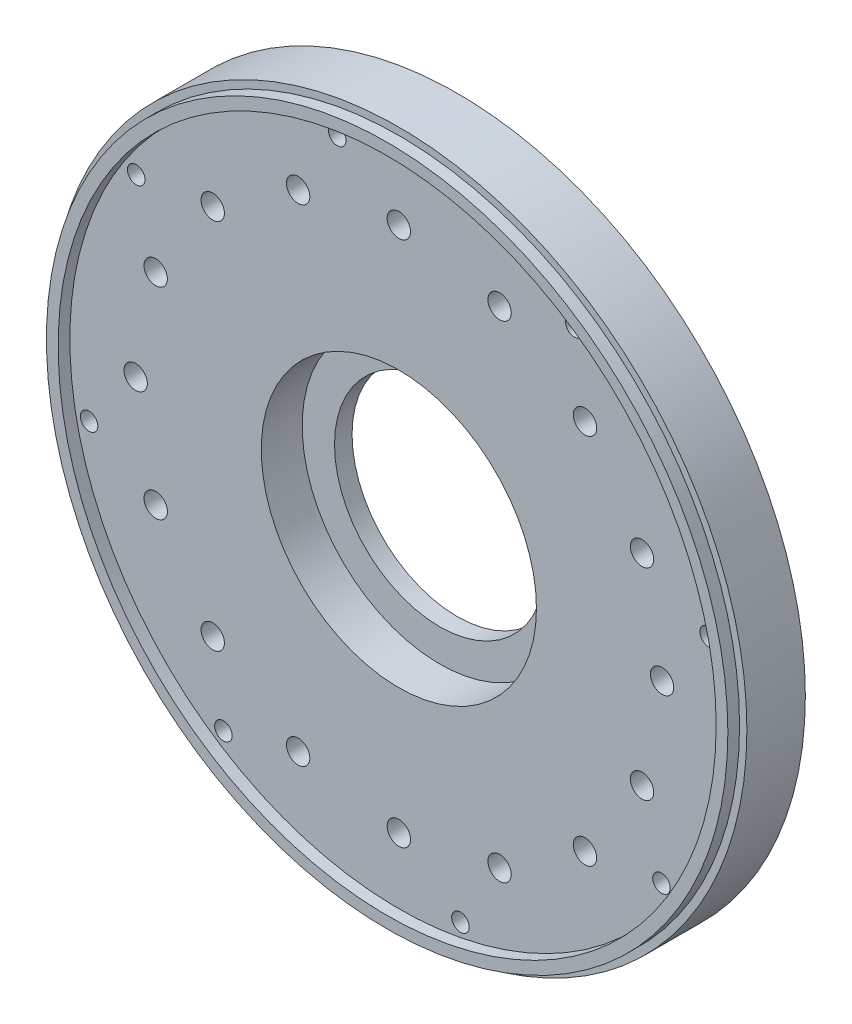
ISO-10303-21;
HEADER;
FILE_DESCRIPTION(('STEP AP214'),'2;1');
FILE_NAME('part.step','',(''),(''),'','','');
FILE_SCHEMA(('AUTOMOTIVE_DESIGN { 1 0 10303 214 1 1 1 1 }'));
ENDSEC;
DATA;
#1=APPLICATION_CONTEXT('core data for automotive mechanical design processes');
#2=APPLICATION_PROTOCOL_DEFINITION('international standard','automotive_design',2000,#1);
#3=PRODUCT_CONTEXT('',#1,'mechanical');
#4=PRODUCT('Part','Part','',(#3));
#5=PRODUCT_RELATED_PRODUCT_CATEGORY('part','',(#4));
#6=PRODUCT_DEFINITION_FORMATION('','',#4);
#7=PRODUCT_DEFINITION_CONTEXT('part definition',#1,'design');
#8=PRODUCT_DEFINITION('design','',#6,#7);
#9=PRODUCT_DEFINITION_SHAPE('','',#8);
#10=(LENGTH_UNIT() NAMED_UNIT(*) SI_UNIT(.MILLI.,.METRE.));
#11=(NAMED_UNIT(*) PLANE_ANGLE_UNIT() SI_UNIT($,.RADIAN.));
#12=(NAMED_UNIT(*) SI_UNIT($,.STERADIAN.) SOLID_ANGLE_UNIT());
#13=UNCERTAINTY_MEASURE_WITH_UNIT(LENGTH_MEASURE(1.E-05),#10,'distance_accuracy_value','');
#14=(GEOMETRIC_REPRESENTATION_CONTEXT(3) GLOBAL_UNCERTAINTY_ASSIGNED_CONTEXT((#13)) GLOBAL_UNIT_ASSIGNED_CONTEXT((#10,
#11,#12)) REPRESENTATION_CONTEXT('',''));
#15=CARTESIAN_POINT('',(0.,0.,0.));
#16=DIRECTION('',(0.,0.,1.));
#17=DIRECTION('',(1.,0.,0.));
#18=AXIS2_PLACEMENT_3D('',#15,#16,#17);
#19=CARTESIAN_POINT('',(0.,0.,10.));
#20=DIRECTION('',(0.,0.,1.));
#21=DIRECTION('',(1.,0.,0.));
#22=AXIS2_PLACEMENT_3D('',#19,#20,#21);
#23=PLANE('',#22);
#24=CARTESIAN_POINT('',(0.,0.,10.));
#25=DIRECTION('',(0.,0.,1.));
#26=DIRECTION('',(1.,0.,0.));
#27=AXIS2_PLACEMENT_3D('',#24,#25,#26);
#28=CIRCLE('',#27,23.525);
#29=CARTESIAN_POINT('',(23.525,0.,10.));
#30=VERTEX_POINT('',#29);
#31=EDGE_CURVE('E57',#30,#30,#28,.T.);
#32=ORIENTED_EDGE('',*,*,#31,.F.);
#33=EDGE_LOOP('',(#32));
#34=FACE_BOUND('',#33,.T.);
#35=CARTESIAN_POINT('',(45.,0.,10.));
#36=DIRECTION('',(0.,0.,1.));
#37=DIRECTION('',(1.,0.,0.));
#38=AXIS2_PLACEMENT_3D('',#35,#36,#37);
#39=CIRCLE('',#38,2.);
#40=CARTESIAN_POINT('',(47.,0.,10.));
#41=VERTEX_POINT('',#40);
#42=EDGE_CURVE('E69',#41,#41,#39,.T.);
#43=ORIENTED_EDGE('',*,*,#42,.F.);
#44=EDGE_LOOP('',(#43));
#45=FACE_BOUND('',#44,.T.);
#46=CARTESIAN_POINT('',(41.5745789630079,-17.2207544564291,10.));
#47=DIRECTION('',(0.,0.,1.));
#48=DIRECTION('',(1.,0.,0.));
#49=AXIS2_PLACEMENT_3D('',#46,#47,#48);
#50=CIRCLE('',#49,2.);
#51=CARTESIAN_POINT('',(43.5745789630079,-17.2207544564291,10.));
#52=VERTEX_POINT('',#51);
#53=EDGE_CURVE('E160',#52,#52,#50,.T.);
#54=ORIENTED_EDGE('',*,*,#53,.F.);
#55=EDGE_LOOP('',(#54));
#56=FACE_BOUND('',#55,.T.);
#57=CARTESIAN_POINT('',(31.8198051533946,-31.8198051533947,10.));
#58=DIRECTION('',(0.,0.,1.));
#59=DIRECTION('',(1.,0.,0.));
#60=AXIS2_PLACEMENT_3D('',#57,#58,#59);
#61=CIRCLE('',#60,2.);
#62=CARTESIAN_POINT('',(33.8198051533946,-31.8198051533947,10.));
#63=VERTEX_POINT('',#62);
#64=EDGE_CURVE('E154',#63,#63,#61,.T.);
#65=ORIENTED_EDGE('',*,*,#64,.F.);
#66=EDGE_LOOP('',(#65));
#67=FACE_BOUND('',#66,.T.);
#68=CARTESIAN_POINT('',(17.2207544564289,-41.574578963008,10.));
#69=DIRECTION('',(0.,0.,1.));
#70=DIRECTION('',(1.,0.,0.));
#71=AXIS2_PLACEMENT_3D('',#68,#69,#70);
#72=CIRCLE('',#71,2.);
#73=CARTESIAN_POINT('',(19.2207544564289,-41.574578963008,10.));
#74=VERTEX_POINT('',#73);
#75=EDGE_CURVE('E148',#74,#74,#72,.T.);
#76=ORIENTED_EDGE('',*,*,#75,.F.);
#77=EDGE_LOOP('',(#76));
#78=FACE_BOUND('',#77,.T.);
#79=CARTESIAN_POINT('',(-1.57116660247941E-13,-45.,10.));
#80=DIRECTION('',(0.,0.,1.));
#81=DIRECTION('',(1.,0.,0.));
#82=AXIS2_PLACEMENT_3D('',#79,#80,#81);
#83=CIRCLE('',#82,2.);
#84=CARTESIAN_POINT('',(1.99999999999984,-45.,10.));
#85=VERTEX_POINT('',#84);
#86=EDGE_CURVE('E142',#85,#85,#83,.T.);
#87=ORIENTED_EDGE('',*,*,#86,.F.);
#88=EDGE_LOOP('',(#87));
#89=FACE_BOUND('',#88,.T.);
#90=CARTESIAN_POINT('',(-17.2207544564292,-41.5745789630078,10.));
#91=DIRECTION('',(0.,0.,1.));
#92=DIRECTION('',(1.,0.,0.));
#93=AXIS2_PLACEMENT_3D('',#90,#91,#92);
#94=CIRCLE('',#93,2.);
#95=CARTESIAN_POINT('',(-15.2207544564292,-41.5745789630078,10.));
#96=VERTEX_POINT('',#95);
#97=EDGE_CURVE('E136',#96,#96,#94,.T.);
#98=ORIENTED_EDGE('',*,*,#97,.F.);
#99=EDGE_LOOP('',(#98));
#100=FACE_BOUND('',#99,.T.);
#101=CARTESIAN_POINT('',(-31.8198051533948,-31.8198051533945,10.));
#102=DIRECTION('',(0.,0.,1.));
#103=DIRECTION('',(1.,0.,0.));
#104=AXIS2_PLACEMENT_3D('',#101,#102,#103);
#105=CIRCLE('',#104,2.);
#106=CARTESIAN_POINT('',(-29.8198051533948,-31.8198051533945,10.));
#107=VERTEX_POINT('',#106);
#108=EDGE_CURVE('E130',#107,#107,#105,.T.);
#109=ORIENTED_EDGE('',*,*,#108,.F.);
#110=EDGE_LOOP('',(#109));
#111=FACE_BOUND('',#110,.T.);
#112=CARTESIAN_POINT('',(-41.574578963008,-17.2207544564288,10.));
#113=DIRECTION('',(0.,0.,1.));
#114=DIRECTION('',(1.,0.,0.));
#115=AXIS2_PLACEMENT_3D('',#112,#113,#114);
#116=CIRCLE('',#115,2.);
#117=CARTESIAN_POINT('',(-39.574578963008,-17.2207544564288,10.));
#118=VERTEX_POINT('',#117);
#119=EDGE_CURVE('E124',#118,#118,#116,.T.);
#120=ORIENTED_EDGE('',*,*,#119,.F.);
#121=EDGE_LOOP('',(#120));
#122=FACE_BOUND('',#121,.T.);
#123=CARTESIAN_POINT('',(-45.,3.14233320495882E-13,10.));
#124=DIRECTION('',(0.,0.,1.));
#125=DIRECTION('',(1.,0.,0.));
#126=AXIS2_PLACEMENT_3D('',#123,#124,#125);
#127=CIRCLE('',#126,2.);
#128=CARTESIAN_POINT('',(-43.,3.14233320495882E-13,10.));
#129=VERTEX_POINT('',#128);
#130=EDGE_CURVE('E118',#129,#129,#127,.T.);
#131=ORIENTED_EDGE('',*,*,#130,.F.);
#132=EDGE_LOOP('',(#131));
#133=FACE_BOUND('',#132,.T.);
#134=CARTESIAN_POINT('',(-41.5745789630078,17.2207544564294,10.));
#135=DIRECTION('',(0.,0.,1.));
#136=DIRECTION('',(1.,0.,0.));
#137=AXIS2_PLACEMENT_3D('',#134,#135,#136);
#138=CIRCLE('',#137,2.);
#139=CARTESIAN_POINT('',(-39.5745789630078,17.2207544564294,10.));
#140=VERTEX_POINT('',#139);
#141=EDGE_CURVE('E112',#140,#140,#138,.T.);
#142=ORIENTED_EDGE('',*,*,#141,.F.);
#143=EDGE_LOOP('',(#142));
#144=FACE_BOUND('',#143,.T.);
#145=CARTESIAN_POINT('',(-31.8198051533944,31.8198051533949,10.));
#146=DIRECTION('',(0.,0.,1.));
#147=DIRECTION('',(1.,0.,0.));
#148=AXIS2_PLACEMENT_3D('',#145,#146,#147);
#149=CIRCLE('',#148,2.);
#150=CARTESIAN_POINT('',(-29.8198051533944,31.8198051533949,10.));
#151=VERTEX_POINT('',#150);
#152=EDGE_CURVE('E106',#151,#151,#149,.T.);
#153=ORIENTED_EDGE('',*,*,#152,.F.);
#154=EDGE_LOOP('',(#153));
#155=FACE_BOUND('',#154,.T.);
#156=CARTESIAN_POINT('',(-17.2207544564286,41.5745789630081,10.));
#157=DIRECTION('',(0.,0.,1.));
#158=DIRECTION('',(1.,0.,0.));
#159=AXIS2_PLACEMENT_3D('',#156,#157,#158);
#160=CIRCLE('',#159,2.);
#161=CARTESIAN_POINT('',(-15.2207544564286,41.5745789630081,10.));
#162=VERTEX_POINT('',#161);
#163=EDGE_CURVE('E100',#162,#162,#160,.T.);
#164=ORIENTED_EDGE('',*,*,#163,.F.);
#165=EDGE_LOOP('',(#164));
#166=FACE_BOUND('',#165,.T.);
#167=CARTESIAN_POINT('',(4.71349980743823E-13,45.,10.));
#168=DIRECTION('',(0.,0.,1.));
#169=DIRECTION('',(1.,0.,0.));
#170=AXIS2_PLACEMENT_3D('',#167,#168,#169);
#171=CIRCLE('',#170,2.);
#172=CARTESIAN_POINT('',(2.00000000000047,45.,10.));
#173=VERTEX_POINT('',#172);
#174=EDGE_CURVE('E94',#173,#173,#171,.T.);
#175=ORIENTED_EDGE('',*,*,#174,.F.);
#176=EDGE_LOOP('',(#175));
#177=FACE_BOUND('',#176,.T.);
#178=CARTESIAN_POINT('',(17.2207544564295,41.5745789630077,10.));
#179=DIRECTION('',(0.,0.,1.));
#180=DIRECTION('',(1.,0.,0.));
#181=AXIS2_PLACEMENT_3D('',#178,#179,#180);
#182=CIRCLE('',#181,2.);
#183=CARTESIAN_POINT('',(19.2207544564295,41.5745789630077,10.));
#184=VERTEX_POINT('',#183);
#185=EDGE_CURVE('E88',#184,#184,#182,.T.);
#186=ORIENTED_EDGE('',*,*,#185,.F.);
#187=EDGE_LOOP('',(#186));
#188=FACE_BOUND('',#187,.T.);
#189=CARTESIAN_POINT('',(31.819805153395,31.8198051533942,10.));
#190=DIRECTION('',(0.,0.,1.));
#191=DIRECTION('',(1.,0.,0.));
#192=AXIS2_PLACEMENT_3D('',#189,#190,#191);
#193=CIRCLE('',#192,2.);
#194=CARTESIAN_POINT('',(33.819805153395,31.8198051533942,10.));
#195=VERTEX_POINT('',#194);
#196=EDGE_CURVE('E82',#195,#195,#193,.T.);
#197=ORIENTED_EDGE('',*,*,#196,.F.);
#198=EDGE_LOOP('',(#197));
#199=FACE_BOUND('',#198,.T.);
#200=CARTESIAN_POINT('',(41.5745789630081,17.2207544564285,10.));
#201=DIRECTION('',(0.,0.,1.));
#202=DIRECTION('',(1.,0.,0.));
#203=AXIS2_PLACEMENT_3D('',#200,#201,#202);
#204=CIRCLE('',#203,2.);
#205=CARTESIAN_POINT('',(43.5745789630082,17.2207544564285,10.));
#206=VERTEX_POINT('',#205);
#207=EDGE_CURVE('E75',#206,#206,#204,.T.);
#208=ORIENTED_EDGE('',*,*,#207,.F.);
#209=EDGE_LOOP('',(#208));
#210=FACE_BOUND('',#209,.T.);
#211=CARTESIAN_POINT('',(30.0007925830584,44.8993590643375,10.));
#212=DIRECTION('',(0.,0.,1.));
#213=DIRECTION('',(1.,0.,0.));
#214=AXIS2_PLACEMENT_3D('',#211,#212,#213);
#215=CIRCLE('',#214,1.5);
#216=CARTESIAN_POINT('',(31.5007925830584,44.8993590643375,10.));
#217=VERTEX_POINT('',#216);
#218=EDGE_CURVE('E165',#217,#217,#215,.T.);
#219=ORIENTED_EDGE('',*,*,#218,.F.);
#220=EDGE_LOOP('',(#219));
#221=FACE_BOUND('',#220,.T.);
#222=CARTESIAN_POINT('',(-10.5348773888717,52.962405141771,10.));
#223=DIRECTION('',(0.,0.,1.));
#224=DIRECTION('',(1.,0.,0.));
#225=AXIS2_PLACEMENT_3D('',#222,#223,#224);
#226=CIRCLE('',#225,1.5000000000038);
#227=CARTESIAN_POINT('',(-9.03487738886794,52.962405141771,10.));
#228=VERTEX_POINT('',#227);
#229=EDGE_CURVE('E195',#228,#228,#226,.T.);
#230=ORIENTED_EDGE('',*,*,#229,.F.);
#231=EDGE_LOOP('',(#230));
#232=FACE_BOUND('',#231,.T.);
#233=CARTESIAN_POINT('',(-44.8993590643363,30.0007925830521,10.));
#234=DIRECTION('',(0.,0.,1.));
#235=DIRECTION('',(1.,0.,0.));
#236=AXIS2_PLACEMENT_3D('',#233,#234,#235);
#237=CIRCLE('',#236,1.50000000000683);
#238=CARTESIAN_POINT('',(-43.3993590643294,30.0007925830521,10.));
#239=VERTEX_POINT('',#238);
#240=EDGE_CURVE('E202',#239,#239,#237,.T.);
#241=ORIENTED_EDGE('',*,*,#240,.F.);
#242=EDGE_LOOP('',(#241));
#243=FACE_BOUND('',#242,.T.);
#244=CARTESIAN_POINT('',(-52.9624051417697,-10.5348773888781,10.));
#245=DIRECTION('',(0.,0.,1.));
#246=DIRECTION('',(1.,0.,0.));
#247=AXIS2_PLACEMENT_3D('',#244,#245,#246);
#248=CIRCLE('',#247,1.50000000000776);
#249=CARTESIAN_POINT('',(-51.462405141762,-10.5348773888781,10.));
#250=VERTEX_POINT('',#249);
#251=EDGE_CURVE('E208',#250,#250,#248,.T.);
#252=ORIENTED_EDGE('',*,*,#251,.F.);
#253=EDGE_LOOP('',(#252));
#254=FACE_BOUND('',#253,.T.);
#255=CARTESIAN_POINT('',(-30.0007925830508,-44.8993590643427,10.));
#256=DIRECTION('',(0.,0.,1.));
#257=DIRECTION('',(1.,0.,0.));
#258=AXIS2_PLACEMENT_3D('',#255,#256,#257);
#259=CIRCLE('',#258,1.50000000000605);
#260=CARTESIAN_POINT('',(-28.5007925830447,-44.8993590643427,10.));
#261=VERTEX_POINT('',#260);
#262=EDGE_CURVE('E171',#261,#261,#259,.T.);
#263=ORIENTED_EDGE('',*,*,#262,.F.);
#264=EDGE_LOOP('',(#263));
#265=FACE_BOUND('',#264,.T.);
#266=CARTESIAN_POINT('',(10.5348773888794,-52.9624051417761,10.));
#267=DIRECTION('',(0.,0.,1.));
#268=DIRECTION('',(1.,0.,0.));
#269=AXIS2_PLACEMENT_3D('',#266,#267,#268);
#270=CIRCLE('',#269,1.50000000000262);
#271=CARTESIAN_POINT('',(12.034877388882,-52.9624051417761,10.));
#272=VERTEX_POINT('',#271);
#273=EDGE_CURVE('E178',#272,#272,#270,.T.);
#274=ORIENTED_EDGE('',*,*,#273,.F.);
#275=EDGE_LOOP('',(#274));
#276=FACE_BOUND('',#275,.T.);
#277=CARTESIAN_POINT('',(44.8993590643439,-30.0007925830572,10.));
#278=DIRECTION('',(0.,0.,1.));
#279=DIRECTION('',(1.,0.,0.));
#280=AXIS2_PLACEMENT_3D('',#277,#278,#279);
#281=CIRCLE('',#280,1.49999999999946);
#282=CARTESIAN_POINT('',(46.3993590643434,-30.0007925830572,10.));
#283=VERTEX_POINT('',#282);
#284=EDGE_CURVE('E184',#283,#283,#281,.T.);
#285=ORIENTED_EDGE('',*,*,#284,.F.);
#286=EDGE_LOOP('',(#285));
#287=FACE_BOUND('',#286,.T.);
#288=CARTESIAN_POINT('',(52.9624051417774,10.534877388873,10.));
#289=DIRECTION('',(0.,0.,1.));
#290=DIRECTION('',(1.,0.,0.));
#291=AXIS2_PLACEMENT_3D('',#288,#289,#290);
#292=CIRCLE('',#291,1.4999999999984);
#293=CARTESIAN_POINT('',(54.4624051417758,10.534877388873,10.));
#294=VERTEX_POINT('',#293);
#295=EDGE_CURVE('E190',#294,#294,#292,.T.);
#296=ORIENTED_EDGE('',*,*,#295,.F.);
#297=EDGE_LOOP('',(#296));
#298=FACE_BOUND('',#297,.T.);
#299=CARTESIAN_POINT('',(0.,0.,10.));
#300=DIRECTION('',(0.,0.,1.));
#301=DIRECTION('',(1.,0.,0.));
#302=AXIS2_PLACEMENT_3D('',#299,#300,#301);
#303=CIRCLE('',#302,56.25);
#304=CARTESIAN_POINT('',(56.25,0.,10.));
#305=VERTEX_POINT('',#304);
#306=EDGE_CURVE('E10',#305,#305,#303,.F.);
#307=ORIENTED_EDGE('',*,*,#306,.F.);
#308=EDGE_LOOP('',(#307));
#309=FACE_BOUND('',#308,.T.);
#310=ADVANCED_FACE('F39',(#34,#45,#56,#67,#78,#89,#100,#111,#122,#133,#144,#155,#166,#177,#188,
#199,#210,#221,#232,#243,#254,#265,#276,#287,#298,#309),#23,.T.);
#311=CARTESIAN_POINT('',(0.,0.,10.));
#312=DIRECTION('',(0.,0.,-1.));
#313=DIRECTION('',(-1.,0.,0.));
#314=AXIS2_PLACEMENT_3D('',#311,#312,#313);
#315=CYLINDRICAL_SURFACE('',#314,59.5);
#316=CARTESIAN_POINT('',(0.,0.,10.));
#317=DIRECTION('',(0.,0.,1.));
#318=DIRECTION('',(1.,0.,0.));
#319=AXIS2_PLACEMENT_3D('',#316,#317,#318);
#320=CIRCLE('',#319,59.5);
#321=CARTESIAN_POINT('',(59.5,0.,10.));
#322=VERTEX_POINT('',#321);
#323=EDGE_CURVE('E46',#322,#322,#320,.T.);
#324=ORIENTED_EDGE('',*,*,#323,.F.);
#325=EDGE_LOOP('',(#324));
#326=FACE_BOUND('',#325,.T.);
#327=CARTESIAN_POINT('',(0.,0.,0.));
#328=DIRECTION('',(0.,0.,1.));
#329=DIRECTION('',(1.,0.,0.));
#330=AXIS2_PLACEMENT_3D('',#327,#328,#329);
#331=CIRCLE('',#330,59.5);
#332=CARTESIAN_POINT('',(59.5,0.,0.));
#333=VERTEX_POINT('',#332);
#334=EDGE_CURVE('E50',#333,#333,#331,.T.);
#335=ORIENTED_EDGE('',*,*,#334,.T.);
#336=EDGE_LOOP('',(#335));
#337=FACE_BOUND('',#336,.T.);
#338=ADVANCED_FACE('F41',(#326,#337),#315,.T.);
#339=CARTESIAN_POINT('',(0.,0.,10.));
#340=DIRECTION('',(0.,0.,1.));
#341=DIRECTION('',(1.,0.,0.));
#342=AXIS2_PLACEMENT_3D('',#339,#340,#341);
#343=CIRCLE('',#342,58.25);
#344=CARTESIAN_POINT('',(58.25,0.,10.));
#345=VERTEX_POINT('',#344);
#346=EDGE_CURVE('E213',#345,#345,#343,.T.);
#347=ORIENTED_EDGE('',*,*,#346,.F.);
#348=EDGE_LOOP('',(#347));
#349=FACE_BOUND('',#348,.T.);
#350=ORIENTED_EDGE('',*,*,#323,.T.);
#351=EDGE_LOOP('',(#350));
#352=FACE_BOUND('',#351,.T.);
#353=ADVANCED_FACE('F233',(#349,#352),#23,.T.);
#354=CARTESIAN_POINT('',(0.,0.,0.));
#355=DIRECTION('',(0.,0.,1.));
#356=DIRECTION('',(1.,0.,0.));
#357=AXIS2_PLACEMENT_3D('',#354,#355,#356);
#358=PLANE('',#357);
#359=CARTESIAN_POINT('',(52.9624051417774,10.534877388873,0.));
#360=DIRECTION('',(0.,0.,1.));
#361=DIRECTION('',(1.,0.,0.));
#362=AXIS2_PLACEMENT_3D('',#359,#360,#361);
#363=CIRCLE('',#362,1.4999999999984);
#364=CARTESIAN_POINT('',(54.4624051417758,10.534877388873,0.));
#365=VERTEX_POINT('',#364);
#366=EDGE_CURVE('E168',#365,#365,#363,.T.);
#367=ORIENTED_EDGE('',*,*,#366,.T.);
#368=EDGE_LOOP('',(#367));
#369=FACE_BOUND('',#368,.T.);
#370=CARTESIAN_POINT('',(44.8993590643439,-30.0007925830572,0.));
#371=DIRECTION('',(0.,0.,1.));
#372=DIRECTION('',(1.,0.,0.));
#373=AXIS2_PLACEMENT_3D('',#370,#371,#372);
#374=CIRCLE('',#373,1.49999999999946);
#375=CARTESIAN_POINT('',(46.3993590643434,-30.0007925830572,0.));
#376=VERTEX_POINT('',#375);
#377=EDGE_CURVE('E187',#376,#376,#374,.T.);
#378=ORIENTED_EDGE('',*,*,#377,.T.);
#379=EDGE_LOOP('',(#378));
#380=FACE_BOUND('',#379,.T.);
#381=CARTESIAN_POINT('',(10.5348773888794,-52.9624051417761,0.));
#382=DIRECTION('',(0.,0.,1.));
#383=DIRECTION('',(1.,0.,0.));
#384=AXIS2_PLACEMENT_3D('',#381,#382,#383);
#385=CIRCLE('',#384,1.50000000000262);
#386=CARTESIAN_POINT('',(12.034877388882,-52.9624051417761,0.));
#387=VERTEX_POINT('',#386);
#388=EDGE_CURVE('E181',#387,#387,#385,.T.);
#389=ORIENTED_EDGE('',*,*,#388,.T.);
#390=EDGE_LOOP('',(#389));
#391=FACE_BOUND('',#390,.T.);
#392=CARTESIAN_POINT('',(-30.0007925830508,-44.8993590643427,0.));
#393=DIRECTION('',(0.,0.,1.));
#394=DIRECTION('',(1.,0.,0.));
#395=AXIS2_PLACEMENT_3D('',#392,#393,#394);
#396=CIRCLE('',#395,1.50000000000605);
#397=CARTESIAN_POINT('',(-28.5007925830447,-44.8993590643427,0.));
#398=VERTEX_POINT('',#397);
#399=EDGE_CURVE('E174',#398,#398,#396,.T.);
#400=ORIENTED_EDGE('',*,*,#399,.T.);
#401=EDGE_LOOP('',(#400));
#402=FACE_BOUND('',#401,.T.);
#403=CARTESIAN_POINT('',(-52.9624051417697,-10.5348773888781,0.));
#404=DIRECTION('',(0.,0.,1.));
#405=DIRECTION('',(1.,0.,0.));
#406=AXIS2_PLACEMENT_3D('',#403,#404,#405);
#407=CIRCLE('',#406,1.50000000000776);
#408=CARTESIAN_POINT('',(-51.462405141762,-10.5348773888781,0.));
#409=VERTEX_POINT('',#408);
#410=EDGE_CURVE('E175',#409,#409,#407,.T.);
#411=ORIENTED_EDGE('',*,*,#410,.T.);
#412=EDGE_LOOP('',(#411));
#413=FACE_BOUND('',#412,.T.);
#414=CARTESIAN_POINT('',(-44.8993590643363,30.0007925830521,0.));
#415=DIRECTION('',(0.,0.,1.));
#416=DIRECTION('',(1.,0.,0.));
#417=AXIS2_PLACEMENT_3D('',#414,#415,#416);
#418=CIRCLE('',#417,1.50000000000683);
#419=CARTESIAN_POINT('',(-43.3993590643294,30.0007925830521,0.));
#420=VERTEX_POINT('',#419);
#421=EDGE_CURVE('E205',#420,#420,#418,.T.);
#422=ORIENTED_EDGE('',*,*,#421,.T.);
#423=EDGE_LOOP('',(#422));
#424=FACE_BOUND('',#423,.T.);
#425=CARTESIAN_POINT('',(-10.5348773888717,52.962405141771,0.));
#426=DIRECTION('',(0.,0.,1.));
#427=DIRECTION('',(1.,0.,0.));
#428=AXIS2_PLACEMENT_3D('',#425,#426,#427);
#429=CIRCLE('',#428,1.5000000000038);
#430=CARTESIAN_POINT('',(-9.03487738886794,52.962405141771,0.));
#431=VERTEX_POINT('',#430);
#432=EDGE_CURVE('E198',#431,#431,#429,.T.);
#433=ORIENTED_EDGE('',*,*,#432,.T.);
#434=EDGE_LOOP('',(#433));
#435=FACE_BOUND('',#434,.T.);
#436=CARTESIAN_POINT('',(30.0007925830584,44.8993590643375,0.));
#437=DIRECTION('',(0.,0.,1.));
#438=DIRECTION('',(1.,0.,0.));
#439=AXIS2_PLACEMENT_3D('',#436,#437,#438);
#440=CIRCLE('',#439,1.5);
#441=CARTESIAN_POINT('',(31.5007925830584,44.8993590643375,0.));
#442=VERTEX_POINT('',#441);
#443=EDGE_CURVE('E79',#442,#442,#440,.T.);
#444=ORIENTED_EDGE('',*,*,#443,.T.);
#445=EDGE_LOOP('',(#444));
#446=FACE_BOUND('',#445,.T.);
#447=CARTESIAN_POINT('',(0.,0.,0.));
#448=DIRECTION('',(0.,0.,1.));
#449=DIRECTION('',(1.,0.,0.));
#450=AXIS2_PLACEMENT_3D('',#447,#448,#449);
#451=CIRCLE('',#450,18.);
#452=CARTESIAN_POINT('',(18.,0.,0.));
#453=VERTEX_POINT('',#452);
#454=EDGE_CURVE('E60',#453,#453,#451,.T.);
#455=ORIENTED_EDGE('',*,*,#454,.T.);
#456=EDGE_LOOP('',(#455));
#457=FACE_BOUND('',#456,.T.);
#458=ORIENTED_EDGE('',*,*,#334,.F.);
#459=EDGE_LOOP('',(#458));
#460=FACE_BOUND('',#459,.T.);
#461=ADVANCED_FACE('F235',(#369,#380,#391,#402,#413,#424,#435,#446,#457,#460),#358,.F.);
#462=CARTESIAN_POINT('',(0.,0.,3.));
#463=DIRECTION('',(0.,0.,1.));
#464=DIRECTION('',(1.,0.,0.));
#465=AXIS2_PLACEMENT_3D('',#462,#463,#464);
#466=CYLINDRICAL_SURFACE('',#465,23.525);
#467=CARTESIAN_POINT('',(0.,0.,3.));
#468=DIRECTION('',(0.,0.,1.));
#469=DIRECTION('',(1.,0.,0.));
#470=AXIS2_PLACEMENT_3D('',#467,#468,#469);
#471=CIRCLE('',#470,23.525);
#472=CARTESIAN_POINT('',(23.525,0.,3.));
#473=VERTEX_POINT('',#472);
#474=EDGE_CURVE('E55',#473,#473,#471,.T.);
#475=ORIENTED_EDGE('',*,*,#474,.F.);
#476=EDGE_LOOP('',(#475));
#477=FACE_BOUND('',#476,.T.);
#478=ORIENTED_EDGE('',*,*,#31,.T.);
#479=EDGE_LOOP('',(#478));
#480=FACE_BOUND('',#479,.T.);
#481=ADVANCED_FACE('F242',(#477,#480),#466,.F.);
#482=CARTESIAN_POINT('',(0.,0.,3.));
#483=DIRECTION('',(0.,0.,1.));
#484=DIRECTION('',(1.,0.,0.));
#485=AXIS2_PLACEMENT_3D('',#482,#483,#484);
#486=PLANE('',#485);
#487=CARTESIAN_POINT('',(0.,0.,3.));
#488=DIRECTION('',(0.,0.,1.));
#489=DIRECTION('',(1.,0.,0.));
#490=AXIS2_PLACEMENT_3D('',#487,#488,#489);
#491=CIRCLE('',#490,18.);
#492=CARTESIAN_POINT('',(18.,0.,3.));
#493=VERTEX_POINT('',#492);
#494=EDGE_CURVE('E63',#493,#493,#491,.T.);
#495=ORIENTED_EDGE('',*,*,#494,.F.);
#496=EDGE_LOOP('',(#495));
#497=FACE_BOUND('',#496,.T.);
#498=ORIENTED_EDGE('',*,*,#474,.T.);
#499=EDGE_LOOP('',(#498));
#500=FACE_BOUND('',#499,.T.);
#501=ADVANCED_FACE('F460',(#497,#500),#486,.T.);
#502=CARTESIAN_POINT('',(0.,0.,0.));
#503=DIRECTION('',(0.,0.,1.));
#504=DIRECTION('',(1.,0.,0.));
#505=AXIS2_PLACEMENT_3D('',#502,#503,#504);
#506=CYLINDRICAL_SURFACE('',#505,18.);
#507=ORIENTED_EDGE('',*,*,#454,.F.);
#508=EDGE_LOOP('',(#507));
#509=FACE_BOUND('',#508,.T.);
#510=ORIENTED_EDGE('',*,*,#494,.T.);
#511=EDGE_LOOP('',(#510));
#512=FACE_BOUND('',#511,.T.);
#513=ADVANCED_FACE('F456',(#509,#512),#506,.F.);
#514=CARTESIAN_POINT('',(45.,0.,6.));
#515=DIRECTION('',(0.,0.,1.));
#516=DIRECTION('',(1.,0.,0.));
#517=AXIS2_PLACEMENT_3D('',#514,#515,#516);
#518=CYLINDRICAL_SURFACE('',#517,2.);
#519=CARTESIAN_POINT('',(45.,0.,6.));
#520=DIRECTION('',(0.,0.,1.));
#521=DIRECTION('',(1.,0.,0.));
#522=AXIS2_PLACEMENT_3D('',#519,#520,#521);
#523=CIRCLE('',#522,2.);
#524=CARTESIAN_POINT('',(47.,0.,6.));
#525=VERTEX_POINT('',#524);
#526=EDGE_CURVE('E66',#525,#525,#523,.T.);
#527=ORIENTED_EDGE('',*,*,#526,.F.);
#528=EDGE_LOOP('',(#527));
#529=FACE_BOUND('',#528,.T.);
#530=ORIENTED_EDGE('',*,*,#42,.T.);
#531=EDGE_LOOP('',(#530));
#532=FACE_BOUND('',#531,.T.);
#533=ADVANCED_FACE('F452',(#529,#532),#518,.F.);
#534=CARTESIAN_POINT('',(45.,0.,6.));
#535=DIRECTION('',(0.,0.,1.));
#536=DIRECTION('',(1.,0.,0.));
#537=AXIS2_PLACEMENT_3D('',#534,#535,#536);
#538=PLANE('',#537);
#539=ORIENTED_EDGE('',*,*,#526,.T.);
#540=EDGE_LOOP('',(#539));
#541=FACE_BOUND('',#540,.T.);
#542=ADVANCED_FACE('F338',(#541),#538,.T.);
#543=CARTESIAN_POINT('',(41.5745789630079,-17.2207544564291,6.));
#544=DIRECTION('',(0.,0.,1.));
#545=DIRECTION('',(1.,0.,0.));
#546=AXIS2_PLACEMENT_3D('',#543,#544,#545);
#547=CYLINDRICAL_SURFACE('',#546,2.);
#548=CARTESIAN_POINT('',(41.5745789630079,-17.2207544564291,6.));
#549=DIRECTION('',(0.,0.,1.));
#550=DIRECTION('',(1.,0.,0.));
#551=AXIS2_PLACEMENT_3D('',#548,#549,#550);
#552=CIRCLE('',#551,2.);
#553=CARTESIAN_POINT('',(43.5745789630079,-17.2207544564291,6.));
#554=VERTEX_POINT('',#553);
#555=EDGE_CURVE('E72',#554,#554,#552,.T.);
#556=ORIENTED_EDGE('',*,*,#555,.F.);
#557=EDGE_LOOP('',(#556));
#558=FACE_BOUND('',#557,.T.);
#559=ORIENTED_EDGE('',*,*,#53,.T.);
#560=EDGE_LOOP('',(#559));
#561=FACE_BOUND('',#560,.T.);
#562=ADVANCED_FACE('F334',(#558,#561),#547,.F.);
#563=CARTESIAN_POINT('',(41.5745789630079,-17.2207544564291,6.));
#564=DIRECTION('',(0.,0.,1.));
#565=DIRECTION('',(1.,0.,0.));
#566=AXIS2_PLACEMENT_3D('',#563,#564,#565);
#567=PLANE('',#566);
#568=ORIENTED_EDGE('',*,*,#555,.T.);
#569=EDGE_LOOP('',(#568));
#570=FACE_BOUND('',#569,.T.);
#571=ADVANCED_FACE('F330',(#570),#567,.T.);
#572=CARTESIAN_POINT('',(31.8198051533946,-31.8198051533947,6.));
#573=DIRECTION('',(0.,0.,1.));
#574=DIRECTION('',(1.,0.,0.));
#575=AXIS2_PLACEMENT_3D('',#572,#573,#574);
#576=CYLINDRICAL_SURFACE('',#575,2.);
#577=CARTESIAN_POINT('',(31.8198051533946,-31.8198051533947,6.));
#578=DIRECTION('',(0.,0.,1.));
#579=DIRECTION('',(1.,0.,0.));
#580=AXIS2_PLACEMENT_3D('',#577,#578,#579);
#581=CIRCLE('',#580,2.);
#582=CARTESIAN_POINT('',(33.8198051533946,-31.8198051533947,6.));
#583=VERTEX_POINT('',#582);
#584=EDGE_CURVE('E157',#583,#583,#581,.T.);
#585=ORIENTED_EDGE('',*,*,#584,.F.);
#586=EDGE_LOOP('',(#585));
#587=FACE_BOUND('',#586,.T.);
#588=ORIENTED_EDGE('',*,*,#64,.T.);
#589=EDGE_LOOP('',(#588));
#590=FACE_BOUND('',#589,.T.);
#591=ADVANCED_FACE('F333',(#587,#590),#576,.F.);
#592=CARTESIAN_POINT('',(31.8198051533946,-31.8198051533947,6.));
#593=DIRECTION('',(0.,0.,1.));
#594=DIRECTION('',(1.,0.,0.));
#595=AXIS2_PLACEMENT_3D('',#592,#593,#594);
#596=PLANE('',#595);
#597=ORIENTED_EDGE('',*,*,#584,.T.);
#598=EDGE_LOOP('',(#597));
#599=FACE_BOUND('',#598,.T.);
#600=ADVANCED_FACE('F340',(#599),#596,.T.);
#601=CARTESIAN_POINT('',(17.2207544564289,-41.574578963008,6.));
#602=DIRECTION('',(0.,0.,1.));
#603=DIRECTION('',(1.,0.,0.));
#604=AXIS2_PLACEMENT_3D('',#601,#602,#603);
#605=CYLINDRICAL_SURFACE('',#604,2.);
#606=CARTESIAN_POINT('',(17.2207544564289,-41.574578963008,6.));
#607=DIRECTION('',(0.,0.,1.));
#608=DIRECTION('',(1.,0.,0.));
#609=AXIS2_PLACEMENT_3D('',#606,#607,#608);
#610=CIRCLE('',#609,2.);
#611=CARTESIAN_POINT('',(19.2207544564289,-41.574578963008,6.));
#612=VERTEX_POINT('',#611);
#613=EDGE_CURVE('E151',#612,#612,#610,.T.);
#614=ORIENTED_EDGE('',*,*,#613,.F.);
#615=EDGE_LOOP('',(#614));
#616=FACE_BOUND('',#615,.T.);
#617=ORIENTED_EDGE('',*,*,#75,.T.);
#618=EDGE_LOOP('',(#617));
#619=FACE_BOUND('',#618,.T.);
#620=ADVANCED_FACE('F343',(#616,#619),#605,.F.);
#621=CARTESIAN_POINT('',(17.2207544564289,-41.574578963008,6.));
#622=DIRECTION('',(0.,0.,1.));
#623=DIRECTION('',(1.,0.,0.));
#624=AXIS2_PLACEMENT_3D('',#621,#622,#623);
#625=PLANE('',#624);
#626=ORIENTED_EDGE('',*,*,#613,.T.);
#627=EDGE_LOOP('',(#626));
#628=FACE_BOUND('',#627,.T.);
#629=ADVANCED_FACE('F348',(#628),#625,.T.);
#630=CARTESIAN_POINT('',(-1.57116660247941E-13,-45.,6.));
#631=DIRECTION('',(0.,0.,1.));
#632=DIRECTION('',(1.,0.,0.));
#633=AXIS2_PLACEMENT_3D('',#630,#631,#632);
#634=CYLINDRICAL_SURFACE('',#633,2.);
#635=CARTESIAN_POINT('',(-1.57116660247941E-13,-45.,6.));
#636=DIRECTION('',(0.,0.,1.));
#637=DIRECTION('',(1.,0.,0.));
#638=AXIS2_PLACEMENT_3D('',#635,#636,#637);
#639=CIRCLE('',#638,2.);
#640=CARTESIAN_POINT('',(1.99999999999984,-45.,6.));
#641=VERTEX_POINT('',#640);
#642=EDGE_CURVE('E145',#641,#641,#639,.T.);
#643=ORIENTED_EDGE('',*,*,#642,.F.);
#644=EDGE_LOOP('',(#643));
#645=FACE_BOUND('',#644,.T.);
#646=ORIENTED_EDGE('',*,*,#86,.T.);
#647=EDGE_LOOP('',(#646));
#648=FACE_BOUND('',#647,.T.);
#649=ADVANCED_FACE('F351',(#645,#648),#634,.F.);
#650=CARTESIAN_POINT('',(-1.57116660247941E-13,-45.,6.));
#651=DIRECTION('',(0.,0.,1.));
#652=DIRECTION('',(1.,0.,0.));
#653=AXIS2_PLACEMENT_3D('',#650,#651,#652);
#654=PLANE('',#653);
#655=ORIENTED_EDGE('',*,*,#642,.T.);
#656=EDGE_LOOP('',(#655));
#657=FACE_BOUND('',#656,.T.);
#658=ADVANCED_FACE('F356',(#657),#654,.T.);
#659=CARTESIAN_POINT('',(-17.2207544564292,-41.5745789630078,6.));
#660=DIRECTION('',(0.,0.,1.));
#661=DIRECTION('',(1.,0.,0.));
#662=AXIS2_PLACEMENT_3D('',#659,#660,#661);
#663=CYLINDRICAL_SURFACE('',#662,2.);
#664=CARTESIAN_POINT('',(-17.2207544564292,-41.5745789630078,6.));
#665=DIRECTION('',(0.,0.,1.));
#666=DIRECTION('',(1.,0.,0.));
#667=AXIS2_PLACEMENT_3D('',#664,#665,#666);
#668=CIRCLE('',#667,2.);
#669=CARTESIAN_POINT('',(-15.2207544564292,-41.5745789630078,6.));
#670=VERTEX_POINT('',#669);
#671=EDGE_CURVE('E139',#670,#670,#668,.T.);
#672=ORIENTED_EDGE('',*,*,#671,.F.);
#673=EDGE_LOOP('',(#672));
#674=FACE_BOUND('',#673,.T.);
#675=ORIENTED_EDGE('',*,*,#97,.T.);
#676=EDGE_LOOP('',(#675));
#677=FACE_BOUND('',#676,.T.);
#678=ADVANCED_FACE('F359',(#674,#677),#663,.F.);
#679=CARTESIAN_POINT('',(-17.2207544564292,-41.5745789630078,6.));
#680=DIRECTION('',(0.,0.,1.));
#681=DIRECTION('',(1.,0.,0.));
#682=AXIS2_PLACEMENT_3D('',#679,#680,#681);
#683=PLANE('',#682);
#684=ORIENTED_EDGE('',*,*,#671,.T.);
#685=EDGE_LOOP('',(#684));
#686=FACE_BOUND('',#685,.T.);
#687=ADVANCED_FACE('F364',(#686),#683,.T.);
#688=CARTESIAN_POINT('',(-31.8198051533948,-31.8198051533945,6.));
#689=DIRECTION('',(0.,0.,1.));
#690=DIRECTION('',(1.,0.,0.));
#691=AXIS2_PLACEMENT_3D('',#688,#689,#690);
#692=CYLINDRICAL_SURFACE('',#691,2.);
#693=CARTESIAN_POINT('',(-31.8198051533948,-31.8198051533945,6.));
#694=DIRECTION('',(0.,0.,1.));
#695=DIRECTION('',(1.,0.,0.));
#696=AXIS2_PLACEMENT_3D('',#693,#694,#695);
#697=CIRCLE('',#696,2.);
#698=CARTESIAN_POINT('',(-29.8198051533948,-31.8198051533945,6.));
#699=VERTEX_POINT('',#698);
#700=EDGE_CURVE('E133',#699,#699,#697,.T.);
#701=ORIENTED_EDGE('',*,*,#700,.F.);
#702=EDGE_LOOP('',(#701));
#703=FACE_BOUND('',#702,.T.);
#704=ORIENTED_EDGE('',*,*,#108,.T.);
#705=EDGE_LOOP('',(#704));
#706=FACE_BOUND('',#705,.T.);
#707=ADVANCED_FACE('F367',(#703,#706),#692,.F.);
#708=CARTESIAN_POINT('',(-31.8198051533948,-31.8198051533945,6.));
#709=DIRECTION('',(0.,0.,1.));
#710=DIRECTION('',(1.,0.,0.));
#711=AXIS2_PLACEMENT_3D('',#708,#709,#710);
#712=PLANE('',#711);
#713=ORIENTED_EDGE('',*,*,#700,.T.);
#714=EDGE_LOOP('',(#713));
#715=FACE_BOUND('',#714,.T.);
#716=ADVANCED_FACE('F372',(#715),#712,.T.);
#717=CARTESIAN_POINT('',(-41.574578963008,-17.2207544564288,6.));
#718=DIRECTION('',(0.,0.,1.));
#719=DIRECTION('',(1.,0.,0.));
#720=AXIS2_PLACEMENT_3D('',#717,#718,#719);
#721=CYLINDRICAL_SURFACE('',#720,2.);
#722=CARTESIAN_POINT('',(-41.574578963008,-17.2207544564288,6.));
#723=DIRECTION('',(0.,0.,1.));
#724=DIRECTION('',(1.,0.,0.));
#725=AXIS2_PLACEMENT_3D('',#722,#723,#724);
#726=CIRCLE('',#725,2.);
#727=CARTESIAN_POINT('',(-39.574578963008,-17.2207544564288,6.));
#728=VERTEX_POINT('',#727);
#729=EDGE_CURVE('E127',#728,#728,#726,.T.);
#730=ORIENTED_EDGE('',*,*,#729,.F.);
#731=EDGE_LOOP('',(#730));
#732=FACE_BOUND('',#731,.T.);
#733=ORIENTED_EDGE('',*,*,#119,.T.);
#734=EDGE_LOOP('',(#733));
#735=FACE_BOUND('',#734,.T.);
#736=ADVANCED_FACE('F375',(#732,#735),#721,.F.);
#737=CARTESIAN_POINT('',(-41.574578963008,-17.2207544564288,6.));
#738=DIRECTION('',(0.,0.,1.));
#739=DIRECTION('',(1.,0.,0.));
#740=AXIS2_PLACEMENT_3D('',#737,#738,#739);
#741=PLANE('',#740);
#742=ORIENTED_EDGE('',*,*,#729,.T.);
#743=EDGE_LOOP('',(#742));
#744=FACE_BOUND('',#743,.T.);
#745=ADVANCED_FACE('F380',(#744),#741,.T.);
#746=CARTESIAN_POINT('',(-45.,3.14233320495882E-13,6.));
#747=DIRECTION('',(0.,0.,1.));
#748=DIRECTION('',(1.,0.,0.));
#749=AXIS2_PLACEMENT_3D('',#746,#747,#748);
#750=CYLINDRICAL_SURFACE('',#749,2.);
#751=CARTESIAN_POINT('',(-45.,3.14233320495882E-13,6.));
#752=DIRECTION('',(0.,0.,1.));
#753=DIRECTION('',(1.,0.,0.));
#754=AXIS2_PLACEMENT_3D('',#751,#752,#753);
#755=CIRCLE('',#754,2.);
#756=CARTESIAN_POINT('',(-43.,3.14233320495882E-13,6.));
#757=VERTEX_POINT('',#756);
#758=EDGE_CURVE('E121',#757,#757,#755,.T.);
#759=ORIENTED_EDGE('',*,*,#758,.F.);
#760=EDGE_LOOP('',(#759));
#761=FACE_BOUND('',#760,.T.);
#762=ORIENTED_EDGE('',*,*,#130,.T.);
#763=EDGE_LOOP('',(#762));
#764=FACE_BOUND('',#763,.T.);
#765=ADVANCED_FACE('F383',(#761,#764),#750,.F.);
#766=CARTESIAN_POINT('',(-45.,3.14233320495882E-13,6.));
#767=DIRECTION('',(0.,0.,1.));
#768=DIRECTION('',(1.,0.,0.));
#769=AXIS2_PLACEMENT_3D('',#766,#767,#768);
#770=PLANE('',#769);
#771=ORIENTED_EDGE('',*,*,#758,.T.);
#772=EDGE_LOOP('',(#771));
#773=FACE_BOUND('',#772,.T.);
#774=ADVANCED_FACE('F388',(#773),#770,.T.);
#775=CARTESIAN_POINT('',(-41.5745789630078,17.2207544564294,6.));
#776=DIRECTION('',(0.,0.,1.));
#777=DIRECTION('',(1.,0.,0.));
#778=AXIS2_PLACEMENT_3D('',#775,#776,#777);
#779=CYLINDRICAL_SURFACE('',#778,2.);
#780=CARTESIAN_POINT('',(-41.5745789630078,17.2207544564294,6.));
#781=DIRECTION('',(0.,0.,1.));
#782=DIRECTION('',(1.,0.,0.));
#783=AXIS2_PLACEMENT_3D('',#780,#781,#782);
#784=CIRCLE('',#783,2.);
#785=CARTESIAN_POINT('',(-39.5745789630078,17.2207544564294,6.));
#786=VERTEX_POINT('',#785);
#787=EDGE_CURVE('E115',#786,#786,#784,.T.);
#788=ORIENTED_EDGE('',*,*,#787,.F.);
#789=EDGE_LOOP('',(#788));
#790=FACE_BOUND('',#789,.T.);
#791=ORIENTED_EDGE('',*,*,#141,.T.);
#792=EDGE_LOOP('',(#791));
#793=FACE_BOUND('',#792,.T.);
#794=ADVANCED_FACE('F391',(#790,#793),#779,.F.);
#795=CARTESIAN_POINT('',(-41.5745789630078,17.2207544564294,6.));
#796=DIRECTION('',(0.,0.,1.));
#797=DIRECTION('',(1.,0.,0.));
#798=AXIS2_PLACEMENT_3D('',#795,#796,#797);
#799=PLANE('',#798);
#800=ORIENTED_EDGE('',*,*,#787,.T.);
#801=EDGE_LOOP('',(#800));
#802=FACE_BOUND('',#801,.T.);
#803=ADVANCED_FACE('F396',(#802),#799,.T.);
#804=CARTESIAN_POINT('',(-31.8198051533944,31.8198051533949,6.));
#805=DIRECTION('',(0.,0.,1.));
#806=DIRECTION('',(1.,0.,0.));
#807=AXIS2_PLACEMENT_3D('',#804,#805,#806);
#808=CYLINDRICAL_SURFACE('',#807,2.);
#809=CARTESIAN_POINT('',(-31.8198051533944,31.8198051533949,6.));
#810=DIRECTION('',(0.,0.,1.));
#811=DIRECTION('',(1.,0.,0.));
#812=AXIS2_PLACEMENT_3D('',#809,#810,#811);
#813=CIRCLE('',#812,2.);
#814=CARTESIAN_POINT('',(-29.8198051533944,31.8198051533949,6.));
#815=VERTEX_POINT('',#814);
#816=EDGE_CURVE('E109',#815,#815,#813,.T.);
#817=ORIENTED_EDGE('',*,*,#816,.F.);
#818=EDGE_LOOP('',(#817));
#819=FACE_BOUND('',#818,.T.);
#820=ORIENTED_EDGE('',*,*,#152,.T.);
#821=EDGE_LOOP('',(#820));
#822=FACE_BOUND('',#821,.T.);
#823=ADVANCED_FACE('F399',(#819,#822),#808,.F.);
#824=CARTESIAN_POINT('',(-31.8198051533944,31.8198051533949,6.));
#825=DIRECTION('',(0.,0.,1.));
#826=DIRECTION('',(1.,0.,0.));
#827=AXIS2_PLACEMENT_3D('',#824,#825,#826);
#828=PLANE('',#827);
#829=ORIENTED_EDGE('',*,*,#816,.T.);
#830=EDGE_LOOP('',(#829));
#831=FACE_BOUND('',#830,.T.);
#832=ADVANCED_FACE('F404',(#831),#828,.T.);
#833=CARTESIAN_POINT('',(-17.2207544564286,41.5745789630081,6.));
#834=DIRECTION('',(0.,0.,1.));
#835=DIRECTION('',(1.,0.,0.));
#836=AXIS2_PLACEMENT_3D('',#833,#834,#835);
#837=CYLINDRICAL_SURFACE('',#836,2.);
#838=CARTESIAN_POINT('',(-17.2207544564286,41.5745789630081,6.));
#839=DIRECTION('',(0.,0.,1.));
#840=DIRECTION('',(1.,0.,0.));
#841=AXIS2_PLACEMENT_3D('',#838,#839,#840);
#842=CIRCLE('',#841,2.);
#843=CARTESIAN_POINT('',(-15.2207544564286,41.5745789630081,6.));
#844=VERTEX_POINT('',#843);
#845=EDGE_CURVE('E103',#844,#844,#842,.T.);
#846=ORIENTED_EDGE('',*,*,#845,.F.);
#847=EDGE_LOOP('',(#846));
#848=FACE_BOUND('',#847,.T.);
#849=ORIENTED_EDGE('',*,*,#163,.T.);
#850=EDGE_LOOP('',(#849));
#851=FACE_BOUND('',#850,.T.);
#852=ADVANCED_FACE('F407',(#848,#851),#837,.F.);
#853=CARTESIAN_POINT('',(-17.2207544564286,41.5745789630081,6.));
#854=DIRECTION('',(0.,0.,1.));
#855=DIRECTION('',(1.,0.,0.));
#856=AXIS2_PLACEMENT_3D('',#853,#854,#855);
#857=PLANE('',#856);
#858=ORIENTED_EDGE('',*,*,#845,.T.);
#859=EDGE_LOOP('',(#858));
#860=FACE_BOUND('',#859,.T.);
#861=ADVANCED_FACE('F412',(#860),#857,.T.);
#862=CARTESIAN_POINT('',(4.71349980743823E-13,45.,6.));
#863=DIRECTION('',(0.,0.,1.));
#864=DIRECTION('',(1.,0.,0.));
#865=AXIS2_PLACEMENT_3D('',#862,#863,#864);
#866=CYLINDRICAL_SURFACE('',#865,2.);
#867=CARTESIAN_POINT('',(4.71349980743823E-13,45.,6.));
#868=DIRECTION('',(0.,0.,1.));
#869=DIRECTION('',(1.,0.,0.));
#870=AXIS2_PLACEMENT_3D('',#867,#868,#869);
#871=CIRCLE('',#870,2.);
#872=CARTESIAN_POINT('',(2.00000000000047,45.,6.));
#873=VERTEX_POINT('',#872);
#874=EDGE_CURVE('E97',#873,#873,#871,.T.);
#875=ORIENTED_EDGE('',*,*,#874,.F.);
#876=EDGE_LOOP('',(#875));
#877=FACE_BOUND('',#876,.T.);
#878=ORIENTED_EDGE('',*,*,#174,.T.);
#879=EDGE_LOOP('',(#878));
#880=FACE_BOUND('',#879,.T.);
#881=ADVANCED_FACE('F415',(#877,#880),#866,.F.);
#882=CARTESIAN_POINT('',(4.71349980743823E-13,45.,6.));
#883=DIRECTION('',(0.,0.,1.));
#884=DIRECTION('',(1.,0.,0.));
#885=AXIS2_PLACEMENT_3D('',#882,#883,#884);
#886=PLANE('',#885);
#887=ORIENTED_EDGE('',*,*,#874,.T.);
#888=EDGE_LOOP('',(#887));
#889=FACE_BOUND('',#888,.T.);
#890=ADVANCED_FACE('F420',(#889),#886,.T.);
#891=CARTESIAN_POINT('',(17.2207544564295,41.5745789630077,6.));
#892=DIRECTION('',(0.,0.,1.));
#893=DIRECTION('',(1.,0.,0.));
#894=AXIS2_PLACEMENT_3D('',#891,#892,#893);
#895=CYLINDRICAL_SURFACE('',#894,2.);
#896=CARTESIAN_POINT('',(17.2207544564295,41.5745789630077,6.));
#897=DIRECTION('',(0.,0.,1.));
#898=DIRECTION('',(1.,0.,0.));
#899=AXIS2_PLACEMENT_3D('',#896,#897,#898);
#900=CIRCLE('',#899,2.);
#901=CARTESIAN_POINT('',(19.2207544564295,41.5745789630077,6.));
#902=VERTEX_POINT('',#901);
#903=EDGE_CURVE('E91',#902,#902,#900,.T.);
#904=ORIENTED_EDGE('',*,*,#903,.F.);
#905=EDGE_LOOP('',(#904));
#906=FACE_BOUND('',#905,.T.);
#907=ORIENTED_EDGE('',*,*,#185,.T.);
#908=EDGE_LOOP('',(#907));
#909=FACE_BOUND('',#908,.T.);
#910=ADVANCED_FACE('F423',(#906,#909),#895,.F.);
#911=CARTESIAN_POINT('',(17.2207544564295,41.5745789630077,6.));
#912=DIRECTION('',(0.,0.,1.));
#913=DIRECTION('',(1.,0.,0.));
#914=AXIS2_PLACEMENT_3D('',#911,#912,#913);
#915=PLANE('',#914);
#916=ORIENTED_EDGE('',*,*,#903,.T.);
#917=EDGE_LOOP('',(#916));
#918=FACE_BOUND('',#917,.T.);
#919=ADVANCED_FACE('F428',(#918),#915,.T.);
#920=CARTESIAN_POINT('',(31.819805153395,31.8198051533942,6.));
#921=DIRECTION('',(0.,0.,1.));
#922=DIRECTION('',(1.,0.,0.));
#923=AXIS2_PLACEMENT_3D('',#920,#921,#922);
#924=CYLINDRICAL_SURFACE('',#923,2.);
#925=CARTESIAN_POINT('',(31.819805153395,31.8198051533942,6.));
#926=DIRECTION('',(0.,0.,1.));
#927=DIRECTION('',(1.,0.,0.));
#928=AXIS2_PLACEMENT_3D('',#925,#926,#927);
#929=CIRCLE('',#928,2.);
#930=CARTESIAN_POINT('',(33.819805153395,31.8198051533942,6.));
#931=VERTEX_POINT('',#930);
#932=EDGE_CURVE('E85',#931,#931,#929,.T.);
#933=ORIENTED_EDGE('',*,*,#932,.F.);
#934=EDGE_LOOP('',(#933));
#935=FACE_BOUND('',#934,.T.);
#936=ORIENTED_EDGE('',*,*,#196,.T.);
#937=EDGE_LOOP('',(#936));
#938=FACE_BOUND('',#937,.T.);
#939=ADVANCED_FACE('F431',(#935,#938),#924,.F.);
#940=CARTESIAN_POINT('',(31.819805153395,31.8198051533942,6.));
#941=DIRECTION('',(0.,0.,1.));
#942=DIRECTION('',(1.,0.,0.));
#943=AXIS2_PLACEMENT_3D('',#940,#941,#942);
#944=PLANE('',#943);
#945=ORIENTED_EDGE('',*,*,#932,.T.);
#946=EDGE_LOOP('',(#945));
#947=FACE_BOUND('',#946,.T.);
#948=ADVANCED_FACE('F436',(#947),#944,.T.);
#949=CARTESIAN_POINT('',(41.5745789630081,17.2207544564285,6.));
#950=DIRECTION('',(0.,0.,1.));
#951=DIRECTION('',(1.,0.,0.));
#952=AXIS2_PLACEMENT_3D('',#949,#950,#951);
#953=CYLINDRICAL_SURFACE('',#952,2.);
#954=CARTESIAN_POINT('',(41.5745789630081,17.2207544564285,6.));
#955=DIRECTION('',(0.,0.,1.));
#956=DIRECTION('',(1.,0.,0.));
#957=AXIS2_PLACEMENT_3D('',#954,#955,#956);
#958=CIRCLE('',#957,2.);
#959=CARTESIAN_POINT('',(43.5745789630082,17.2207544564285,6.));
#960=VERTEX_POINT('',#959);
#961=EDGE_CURVE('E78',#960,#960,#958,.T.);
#962=ORIENTED_EDGE('',*,*,#961,.F.);
#963=EDGE_LOOP('',(#962));
#964=FACE_BOUND('',#963,.T.);
#965=ORIENTED_EDGE('',*,*,#207,.T.);
#966=EDGE_LOOP('',(#965));
#967=FACE_BOUND('',#966,.T.);
#968=ADVANCED_FACE('F439',(#964,#967),#953,.F.);
#969=CARTESIAN_POINT('',(41.5745789630081,17.2207544564285,6.));
#970=DIRECTION('',(0.,0.,1.));
#971=DIRECTION('',(1.,0.,0.));
#972=AXIS2_PLACEMENT_3D('',#969,#970,#971);
#973=PLANE('',#972);
#974=ORIENTED_EDGE('',*,*,#961,.T.);
#975=EDGE_LOOP('',(#974));
#976=FACE_BOUND('',#975,.T.);
#977=ADVANCED_FACE('F328',(#976),#973,.T.);
#978=CARTESIAN_POINT('',(30.0007925830584,44.8993590643375,0.));
#979=DIRECTION('',(0.,0.,1.));
#980=DIRECTION('',(1.,0.,0.));
#981=AXIS2_PLACEMENT_3D('',#978,#979,#980);
#982=CYLINDRICAL_SURFACE('',#981,1.5);
#983=ORIENTED_EDGE('',*,*,#443,.F.);
#984=EDGE_LOOP('',(#983));
#985=FACE_BOUND('',#984,.T.);
#986=ORIENTED_EDGE('',*,*,#218,.T.);
#987=EDGE_LOOP('',(#986));
#988=FACE_BOUND('',#987,.T.);
#989=ADVANCED_FACE('F325',(#985,#988),#982,.F.);
#990=CARTESIAN_POINT('',(-10.5348773888717,52.962405141771,0.));
#991=DIRECTION('',(0.,0.,1.));
#992=DIRECTION('',(1.,0.,0.));
#993=AXIS2_PLACEMENT_3D('',#990,#991,#992);
#994=CYLINDRICAL_SURFACE('',#993,1.5000000000038);
#995=ORIENTED_EDGE('',*,*,#432,.F.);
#996=EDGE_LOOP('',(#995));
#997=FACE_BOUND('',#996,.T.);
#998=ORIENTED_EDGE('',*,*,#229,.T.);
#999=EDGE_LOOP('',(#998));
#1000=FACE_BOUND('',#999,.T.);
#1001=ADVANCED_FACE('F314',(#997,#1000),#994,.F.);
#1002=CARTESIAN_POINT('',(-44.8993590643363,30.0007925830521,0.));
#1003=DIRECTION('',(0.,0.,1.));
#1004=DIRECTION('',(1.,0.,0.));
#1005=AXIS2_PLACEMENT_3D('',#1002,#1003,#1004);
#1006=CYLINDRICAL_SURFACE('',#1005,1.50000000000683);
#1007=ORIENTED_EDGE('',*,*,#421,.F.);
#1008=EDGE_LOOP('',(#1007));
#1009=FACE_BOUND('',#1008,.T.);
#1010=ORIENTED_EDGE('',*,*,#240,.T.);
#1011=EDGE_LOOP('',(#1010));
#1012=FACE_BOUND('',#1011,.T.);
#1013=ADVANCED_FACE('F620',(#1009,#1012),#1006,.F.);
#1014=CARTESIAN_POINT('',(-52.9624051417697,-10.5348773888781,0.));
#1015=DIRECTION('',(0.,0.,1.));
#1016=DIRECTION('',(1.,0.,0.));
#1017=AXIS2_PLACEMENT_3D('',#1014,#1015,#1016);
#1018=CYLINDRICAL_SURFACE('',#1017,1.50000000000776);
#1019=ORIENTED_EDGE('',*,*,#410,.F.);
#1020=EDGE_LOOP('',(#1019));
#1021=FACE_BOUND('',#1020,.T.);
#1022=ORIENTED_EDGE('',*,*,#251,.T.);
#1023=EDGE_LOOP('',(#1022));
#1024=FACE_BOUND('',#1023,.T.);
#1025=ADVANCED_FACE('F323',(#1021,#1024),#1018,.F.);
#1026=CARTESIAN_POINT('',(-30.0007925830508,-44.8993590643427,0.));
#1027=DIRECTION('',(0.,0.,1.));
#1028=DIRECTION('',(1.,0.,0.));
#1029=AXIS2_PLACEMENT_3D('',#1026,#1027,#1028);
#1030=CYLINDRICAL_SURFACE('',#1029,1.50000000000605);
#1031=ORIENTED_EDGE('',*,*,#399,.F.);
#1032=EDGE_LOOP('',(#1031));
#1033=FACE_BOUND('',#1032,.T.);
#1034=ORIENTED_EDGE('',*,*,#262,.T.);
#1035=EDGE_LOOP('',(#1034));
#1036=FACE_BOUND('',#1035,.T.);
#1037=ADVANCED_FACE('F319',(#1033,#1036),#1030,.F.);
#1038=CARTESIAN_POINT('',(10.5348773888794,-52.9624051417761,0.));
#1039=DIRECTION('',(0.,0.,1.));
#1040=DIRECTION('',(1.,0.,0.));
#1041=AXIS2_PLACEMENT_3D('',#1038,#1039,#1040);
#1042=CYLINDRICAL_SURFACE('',#1041,1.50000000000262);
#1043=ORIENTED_EDGE('',*,*,#388,.F.);
#1044=EDGE_LOOP('',(#1043));
#1045=FACE_BOUND('',#1044,.T.);
#1046=ORIENTED_EDGE('',*,*,#273,.T.);
#1047=EDGE_LOOP('',(#1046));
#1048=FACE_BOUND('',#1047,.T.);
#1049=ADVANCED_FACE('F309',(#1045,#1048),#1042,.F.);
#1050=CARTESIAN_POINT('',(44.8993590643439,-30.0007925830572,0.));
#1051=DIRECTION('',(0.,0.,1.));
#1052=DIRECTION('',(1.,0.,0.));
#1053=AXIS2_PLACEMENT_3D('',#1050,#1051,#1052);
#1054=CYLINDRICAL_SURFACE('',#1053,1.49999999999946);
#1055=ORIENTED_EDGE('',*,*,#377,.F.);
#1056=EDGE_LOOP('',(#1055));
#1057=FACE_BOUND('',#1056,.T.);
#1058=ORIENTED_EDGE('',*,*,#284,.T.);
#1059=EDGE_LOOP('',(#1058));
#1060=FACE_BOUND('',#1059,.T.);
#1061=ADVANCED_FACE('F303',(#1057,#1060),#1054,.F.);
#1062=CARTESIAN_POINT('',(52.9624051417774,10.534877388873,0.));
#1063=DIRECTION('',(0.,0.,1.));
#1064=DIRECTION('',(1.,0.,0.));
#1065=AXIS2_PLACEMENT_3D('',#1062,#1063,#1064);
#1066=CYLINDRICAL_SURFACE('',#1065,1.4999999999984);
#1067=ORIENTED_EDGE('',*,*,#366,.F.);
#1068=EDGE_LOOP('',(#1067));
#1069=FACE_BOUND('',#1068,.T.);
#1070=ORIENTED_EDGE('',*,*,#295,.T.);
#1071=EDGE_LOOP('',(#1070));
#1072=FACE_BOUND('',#1071,.T.);
#1073=ADVANCED_FACE('F229',(#1069,#1072),#1066,.F.);
#1074=CARTESIAN_POINT('',(0.,0.,12.));
#1075=DIRECTION('',(0.,0.,-1.));
#1076=DIRECTION('',(-1.,0.,0.));
#1077=AXIS2_PLACEMENT_3D('',#1074,#1075,#1076);
#1078=CYLINDRICAL_SURFACE('',#1077,58.25);
#1079=CARTESIAN_POINT('',(0.,0.,12.));
#1080=DIRECTION('',(0.,0.,1.));
#1081=DIRECTION('',(1.,0.,0.));
#1082=AXIS2_PLACEMENT_3D('',#1079,#1080,#1081);
#1083=CIRCLE('',#1082,58.25);
#1084=CARTESIAN_POINT('',(58.25,0.,12.));
#1085=VERTEX_POINT('',#1084);
#1086=EDGE_CURVE('E216',#1085,#1085,#1083,.T.);
#1087=ORIENTED_EDGE('',*,*,#1086,.F.);
#1088=EDGE_LOOP('',(#1087));
#1089=FACE_BOUND('',#1088,.T.);
#1090=ORIENTED_EDGE('',*,*,#346,.T.);
#1091=EDGE_LOOP('',(#1090));
#1092=FACE_BOUND('',#1091,.T.);
#1093=ADVANCED_FACE('F225',(#1089,#1092),#1078,.T.);
#1094=CARTESIAN_POINT('',(0.,0.,12.));
#1095=DIRECTION('',(0.,0.,-1.));
#1096=DIRECTION('',(-1.,0.,0.));
#1097=AXIS2_PLACEMENT_3D('',#1094,#1095,#1096);
#1098=CYLINDRICAL_SURFACE('',#1097,56.25);
#1099=CARTESIAN_POINT('',(0.,0.,12.));
#1100=DIRECTION('',(0.,0.,1.));
#1101=DIRECTION('',(1.,0.,0.));
#1102=AXIS2_PLACEMENT_3D('',#1099,#1100,#1101);
#1103=CIRCLE('',#1102,56.25);
#1104=CARTESIAN_POINT('',(56.25,0.,12.));
#1105=VERTEX_POINT('',#1104);
#1106=EDGE_CURVE('E199',#1105,#1105,#1103,.T.);
#1107=ORIENTED_EDGE('',*,*,#1106,.T.);
#1108=EDGE_LOOP('',(#1107));
#1109=FACE_BOUND('',#1108,.T.);
#1110=ORIENTED_EDGE('',*,*,#306,.T.);
#1111=EDGE_LOOP('',(#1110));
#1112=FACE_BOUND('',#1111,.T.);
#1113=ADVANCED_FACE('F228',(#1109,#1112),#1098,.F.);
#1114=CARTESIAN_POINT('',(0.,0.,12.));
#1115=DIRECTION('',(0.,0.,1.));
#1116=DIRECTION('',(1.,0.,0.));
#1117=AXIS2_PLACEMENT_3D('',#1114,#1115,#1116);
#1118=PLANE('',#1117);
#1119=ORIENTED_EDGE('',*,*,#1086,.T.);
#1120=EDGE_LOOP('',(#1119));
#1121=FACE_BOUND('',#1120,.T.);
#1122=ORIENTED_EDGE('',*,*,#1106,.F.);
#1123=EDGE_LOOP('',(#1122));
#1124=FACE_BOUND('',#1123,.T.);
#1125=ADVANCED_FACE('F222',(#1121,#1124),#1118,.T.);
#1126=CLOSED_SHELL('',(#310,#338,#353,#461,#481,#501,#513,#533,#542,#562,#571,#591,#600,#620,
#629,#649,#658,#678,#687,#707,#716,#736,#745,#765,#774,#794,#803,#823,#832,#852,#861,#881,#890,
#910,#919,#939,#948,#968,#977,#989,#1001,#1013,#1025,#1037,#1049,#1061,#1073,#1093,#1113,#1125));
#1127=MANIFOLD_SOLID_BREP('B2',#1126);
#1128=ADVANCED_BREP_SHAPE_REPRESENTATION('',(#18,#1127),#14);
#1129=SHAPE_DEFINITION_REPRESENTATION(#9,#1128);
ENDSEC;
END-ISO-10303-21;
